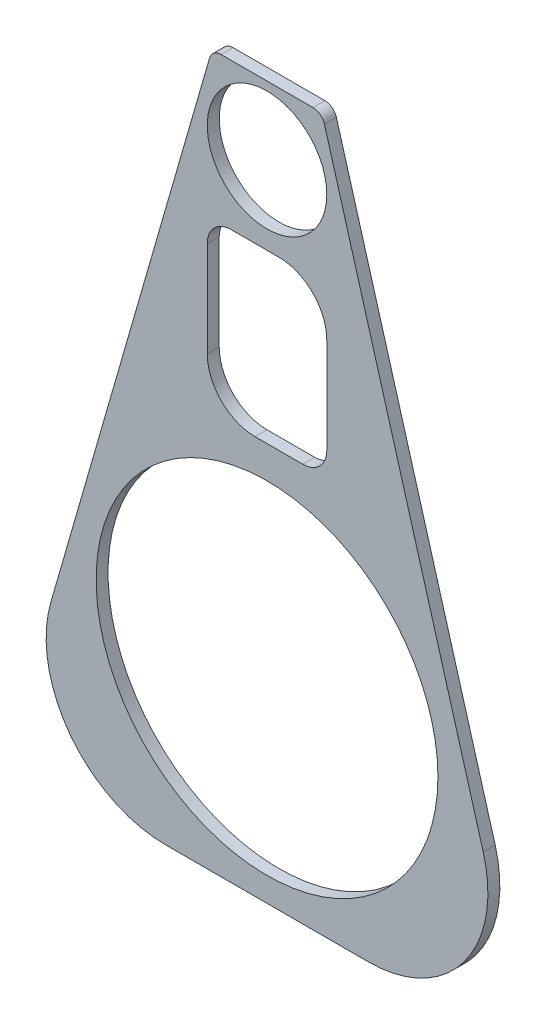
ISO-10303-21;
HEADER;
FILE_DESCRIPTION(('STEP AP214'),'2;1');
FILE_NAME('part.step','',(''),(''),'','','');
FILE_SCHEMA(('AUTOMOTIVE_DESIGN { 1 0 10303 214 1 1 1 1 }'));
ENDSEC;
DATA;
#1=APPLICATION_CONTEXT('core data for automotive mechanical design processes');
#2=APPLICATION_PROTOCOL_DEFINITION('international standard','automotive_design',2000,#1);
#3=PRODUCT_CONTEXT('',#1,'mechanical');
#4=PRODUCT('Part','Part','',(#3));
#5=PRODUCT_RELATED_PRODUCT_CATEGORY('part','',(#4));
#6=PRODUCT_DEFINITION_FORMATION('','',#4);
#7=PRODUCT_DEFINITION_CONTEXT('part definition',#1,'design');
#8=PRODUCT_DEFINITION('design','',#6,#7);
#9=PRODUCT_DEFINITION_SHAPE('','',#8);
#10=(LENGTH_UNIT() NAMED_UNIT(*) SI_UNIT(.MILLI.,.METRE.));
#11=(NAMED_UNIT(*) PLANE_ANGLE_UNIT() SI_UNIT($,.RADIAN.));
#12=(NAMED_UNIT(*) SI_UNIT($,.STERADIAN.) SOLID_ANGLE_UNIT());
#13=UNCERTAINTY_MEASURE_WITH_UNIT(LENGTH_MEASURE(1.E-05),#10,'distance_accuracy_value','');
#14=(GEOMETRIC_REPRESENTATION_CONTEXT(3) GLOBAL_UNCERTAINTY_ASSIGNED_CONTEXT((#13)) GLOBAL_UNIT_ASSIGNED_CONTEXT((#10,
#11,#12)) REPRESENTATION_CONTEXT('',''));
#15=CARTESIAN_POINT('',(0.,0.,0.));
#16=DIRECTION('',(0.,0.,1.));
#17=DIRECTION('',(1.,0.,0.));
#18=AXIS2_PLACEMENT_3D('',#15,#16,#17);
#19=CARTESIAN_POINT('',(4.4629257675573E-13,-1704.94474739678,50.));
#20=DIRECTION('',(0.,1.,0.));
#21=DIRECTION('',(-1.,0.,0.));
#22=AXIS2_PLACEMENT_3D('',#19,#20,#21);
#23=PLANE('',#22);
#24=DIRECTION('',(1.,0.,0.));
#25=VECTOR('',#24,1.);
#26=CARTESIAN_POINT('',(4.4629257675573E-13,-1704.94474739678,0.));
#27=LINE('',#26,#25);
#28=CARTESIAN_POINT('',(-358.81629058388,-1704.94474739678,0.));
#29=VERTEX_POINT('',#28);
#30=CARTESIAN_POINT('',(489.447387935539,-1704.94474739678,0.));
#31=VERTEX_POINT('',#30);
#32=EDGE_CURVE('E240',#29,#31,#27,.T.);
#33=ORIENTED_EDGE('',*,*,#32,.T.);
#34=DIRECTION('',(0.,0.,-1.));
#35=VECTOR('',#34,1.);
#36=CARTESIAN_POINT('',(489.447387935539,-1704.94474739678,50.));
#37=LINE('',#36,#35);
#38=CARTESIAN_POINT('',(489.447387935539,-1704.94474739678,50.));
#39=VERTEX_POINT('',#38);
#40=EDGE_CURVE('E11',#39,#31,#37,.T.);
#41=ORIENTED_EDGE('',*,*,#40,.F.);
#42=DIRECTION('',(1.,0.,0.));
#43=VECTOR('',#42,1.);
#44=CARTESIAN_POINT('',(4.4629257675573E-13,-1704.94474739678,50.));
#45=LINE('',#44,#43);
#46=CARTESIAN_POINT('',(-358.81629058388,-1704.94474739678,50.));
#47=VERTEX_POINT('',#46);
#48=EDGE_CURVE('E359',#47,#39,#45,.T.);
#49=ORIENTED_EDGE('',*,*,#48,.F.);
#50=DIRECTION('',(0.,0.,-1.));
#51=VECTOR('',#50,1.);
#52=CARTESIAN_POINT('',(-358.81629058388,-1704.94474739678,50.));
#53=LINE('',#52,#51);
#54=EDGE_CURVE('E265',#47,#29,#53,.T.);
#55=ORIENTED_EDGE('',*,*,#54,.T.);
#56=EDGE_LOOP('',(#33,#41,#49,#55));
#57=FACE_BOUND('',#56,.T.);
#58=ADVANCED_FACE('F47',(#57),#23,.F.);
#59=CARTESIAN_POINT('',(489.447387935539,-1204.94474739678,50.));
#60=DIRECTION('',(0.,0.,-1.));
#61=DIRECTION('',(-1.,0.,0.));
#62=AXIS2_PLACEMENT_3D('',#59,#60,#61);
#63=CYLINDRICAL_SURFACE('',#62,500.);
#64=CARTESIAN_POINT('',(489.447387935539,-1204.94474739678,0.));
#65=DIRECTION('',(0.,0.,1.));
#66=DIRECTION('',(1.,0.,0.));
#67=AXIS2_PLACEMENT_3D('',#64,#65,#66);
#68=CIRCLE('',#67,500.);
#69=CARTESIAN_POINT('',(969.886005151778,-1066.45743719347,0.));
#70=VERTEX_POINT('',#69);
#71=EDGE_CURVE('E244',#31,#70,#68,.T.);
#72=ORIENTED_EDGE('',*,*,#71,.T.);
#73=DIRECTION('',(0.,0.,-1.));
#74=VECTOR('',#73,1.);
#75=CARTESIAN_POINT('',(969.886005151778,-1066.45743719347,50.));
#76=LINE('',#75,#74);
#77=CARTESIAN_POINT('',(969.886005151778,-1066.45743719347,50.));
#78=VERTEX_POINT('',#77);
#79=EDGE_CURVE('E58',#78,#70,#76,.T.);
#80=ORIENTED_EDGE('',*,*,#79,.F.);
#81=CARTESIAN_POINT('',(489.447387935539,-1204.94474739678,50.));
#82=DIRECTION('',(0.,0.,1.));
#83=DIRECTION('',(1.,0.,0.));
#84=AXIS2_PLACEMENT_3D('',#81,#82,#83);
#85=CIRCLE('',#84,500.);
#86=EDGE_CURVE('E362',#39,#78,#85,.T.);
#87=ORIENTED_EDGE('',*,*,#86,.F.);
#88=ORIENTED_EDGE('',*,*,#40,.T.);
#89=EDGE_LOOP('',(#72,#80,#87,#88));
#90=FACE_BOUND('',#89,.T.);
#91=ADVANCED_FACE('F399',(#90),#63,.T.);
#92=CARTESIAN_POINT('',(611.65576107953,176.310891936767,50.));
#93=DIRECTION('',(-0.960877234432479,-0.276974620406618,0.));
#94=DIRECTION('',(0.276974620406618,-0.960877234432479,0.));
#95=AXIS2_PLACEMENT_3D('',#92,#93,#94);
#96=PLANE('',#95);
#97=DIRECTION('',(-0.276974620406618,0.960877234432479,0.));
#98=VECTOR('',#97,1.);
#99=CARTESIAN_POINT('',(611.65576107953,176.310891936767,0.));
#100=LINE('',#99,#98);
#101=CARTESIAN_POINT('',(305.514251948698,1238.3735683176,0.));
#102=VERTEX_POINT('',#101);
#103=EDGE_CURVE('E247',#70,#102,#100,.T.);
#104=ORIENTED_EDGE('',*,*,#103,.T.);
#105=DIRECTION('',(0.,0.,-1.));
#106=VECTOR('',#105,1.);
#107=CARTESIAN_POINT('',(305.514251948698,1238.3735683176,50.));
#108=LINE('',#107,#106);
#109=CARTESIAN_POINT('',(305.514251948698,1238.3735683176,50.));
#110=VERTEX_POINT('',#109);
#111=EDGE_CURVE('E275',#110,#102,#108,.T.);
#112=ORIENTED_EDGE('',*,*,#111,.F.);
#113=DIRECTION('',(-0.276974620406618,0.960877234432479,0.));
#114=VECTOR('',#113,1.);
#115=CARTESIAN_POINT('',(611.65576107953,176.310891936767,50.));
#116=LINE('',#115,#114);
#117=EDGE_CURVE('E365',#78,#110,#116,.T.);
#118=ORIENTED_EDGE('',*,*,#117,.F.);
#119=ORIENTED_EDGE('',*,*,#79,.T.);
#120=EDGE_LOOP('',(#104,#112,#118,#119));
#121=FACE_BOUND('',#120,.T.);
#122=ADVANCED_FACE('F404',(#121),#96,.F.);
#123=CARTESIAN_POINT('',(257.470390227074,1224.52483729727,50.));
#124=DIRECTION('',(0.,0.,-1.));
#125=DIRECTION('',(-1.,0.,0.));
#126=AXIS2_PLACEMENT_3D('',#123,#124,#125);
#127=CYLINDRICAL_SURFACE('',#126,50.0000000000002);
#128=CARTESIAN_POINT('',(257.470390227074,1224.52483729727,0.));
#129=DIRECTION('',(0.,0.,1.));
#130=DIRECTION('',(1.,0.,0.));
#131=AXIS2_PLACEMENT_3D('',#128,#129,#130);
#132=CIRCLE('',#131,50.0000000000002);
#133=CARTESIAN_POINT('',(257.470390227074,1274.52483729727,0.));
#134=VERTEX_POINT('',#133);
#135=EDGE_CURVE('E250',#102,#134,#132,.T.);
#136=ORIENTED_EDGE('',*,*,#135,.T.);
#137=DIRECTION('',(0.,0.,-1.));
#138=VECTOR('',#137,1.);
#139=CARTESIAN_POINT('',(257.470390227074,1274.52483729727,50.));
#140=LINE('',#139,#138);
#141=CARTESIAN_POINT('',(257.470390227074,1274.52483729727,50.));
#142=VERTEX_POINT('',#141);
#143=EDGE_CURVE('E272',#142,#134,#140,.T.);
#144=ORIENTED_EDGE('',*,*,#143,.F.);
#145=CARTESIAN_POINT('',(257.470390227074,1224.52483729727,50.));
#146=DIRECTION('',(0.,0.,1.));
#147=DIRECTION('',(1.,0.,0.));
#148=AXIS2_PLACEMENT_3D('',#145,#146,#147);
#149=CIRCLE('',#148,50.0000000000002);
#150=EDGE_CURVE('E195',#110,#142,#149,.T.);
#151=ORIENTED_EDGE('',*,*,#150,.F.);
#152=ORIENTED_EDGE('',*,*,#111,.T.);
#153=EDGE_LOOP('',(#136,#144,#151,#152));
#154=FACE_BOUND('',#153,.T.);
#155=ADVANCED_FACE('F373',(#154),#127,.T.);
#156=CARTESIAN_POINT('',(0.,1274.52483729727,50.));
#157=DIRECTION('',(0.,1.,0.));
#158=DIRECTION('',(0.,0.,1.));
#159=AXIS2_PLACEMENT_3D('',#156,#157,#158);
#160=PLANE('',#159);
#161=DIRECTION('',(1.,0.,0.));
#162=VECTOR('',#161,1.);
#163=CARTESIAN_POINT('',(0.,1274.52483729727,0.));
#164=LINE('',#163,#162);
#165=CARTESIAN_POINT('',(-126.839292875416,1274.52483729727,0.));
#166=VERTEX_POINT('',#165);
#167=EDGE_CURVE('E254',#166,#134,#164,.T.);
#168=ORIENTED_EDGE('',*,*,#167,.F.);
#169=DIRECTION('',(0.,0.,-1.));
#170=VECTOR('',#169,1.);
#171=CARTESIAN_POINT('',(-126.839292875416,1274.52483729727,50.));
#172=LINE('',#171,#170);
#173=CARTESIAN_POINT('',(-126.839292875416,1274.52483729727,50.));
#174=VERTEX_POINT('',#173);
#175=EDGE_CURVE('E181',#174,#166,#172,.T.);
#176=ORIENTED_EDGE('',*,*,#175,.F.);
#177=DIRECTION('',(1.,0.,0.));
#178=VECTOR('',#177,1.);
#179=CARTESIAN_POINT('',(0.,1274.52483729727,50.));
#180=LINE('',#179,#178);
#181=EDGE_CURVE('E191',#174,#142,#180,.T.);
#182=ORIENTED_EDGE('',*,*,#181,.T.);
#183=ORIENTED_EDGE('',*,*,#143,.T.);
#184=EDGE_LOOP('',(#168,#176,#182,#183));
#185=FACE_BOUND('',#184,.T.);
#186=ADVANCED_FACE('F377',(#185),#160,.T.);
#187=CARTESIAN_POINT('',(-126.839292875416,1224.52483729727,50.));
#188=DIRECTION('',(0.,0.,-1.));
#189=DIRECTION('',(-1.,0.,0.));
#190=AXIS2_PLACEMENT_3D('',#187,#188,#189);
#191=CYLINDRICAL_SURFACE('',#190,50.0000000000003);
#192=CARTESIAN_POINT('',(-126.839292875416,1224.52483729727,0.));
#193=DIRECTION('',(0.,0.,1.));
#194=DIRECTION('',(1.,0.,0.));
#195=AXIS2_PLACEMENT_3D('',#192,#193,#194);
#196=CIRCLE('',#195,50.0000000000003);
#197=CARTESIAN_POINT('',(-174.88315459704,1238.3735683176,0.));
#198=VERTEX_POINT('',#197);
#199=EDGE_CURVE('E179',#198,#166,#196,.F.);
#200=ORIENTED_EDGE('',*,*,#199,.F.);
#201=DIRECTION('',(0.,0.,-1.));
#202=VECTOR('',#201,1.);
#203=CARTESIAN_POINT('',(-174.88315459704,1238.3735683176,50.));
#204=LINE('',#203,#202);
#205=CARTESIAN_POINT('',(-174.88315459704,1238.3735683176,50.));
#206=VERTEX_POINT('',#205);
#207=EDGE_CURVE('E173',#206,#198,#204,.T.);
#208=ORIENTED_EDGE('',*,*,#207,.F.);
#209=CARTESIAN_POINT('',(-126.839292875416,1224.52483729727,50.));
#210=DIRECTION('',(0.,0.,1.));
#211=DIRECTION('',(1.,0.,0.));
#212=AXIS2_PLACEMENT_3D('',#209,#210,#211);
#213=CIRCLE('',#212,50.0000000000003);
#214=EDGE_CURVE('E177',#206,#174,#213,.F.);
#215=ORIENTED_EDGE('',*,*,#214,.T.);
#216=ORIENTED_EDGE('',*,*,#175,.T.);
#217=EDGE_LOOP('',(#200,#208,#215,#216));
#218=FACE_BOUND('',#217,.T.);
#219=ADVANCED_FACE('F175',(#218),#191,.T.);
#220=CARTESIAN_POINT('',(-491.046020568979,141.544913622189,50.));
#221=DIRECTION('',(0.960877234432479,-0.276974620406618,0.));
#222=DIRECTION('',(0.276974620406618,0.960877234432479,0.));
#223=AXIS2_PLACEMENT_3D('',#220,#221,#222);
#224=PLANE('',#223);
#225=DIRECTION('',(-0.276974620406618,-0.960877234432479,0.));
#226=VECTOR('',#225,1.);
#227=CARTESIAN_POINT('',(-491.046020568979,141.544913622189,0.));
#228=LINE('',#227,#226);
#229=CARTESIAN_POINT('',(-839.254907800119,-1066.45743719347,0.));
#230=VERTEX_POINT('',#229);
#231=EDGE_CURVE('E119',#198,#230,#228,.T.);
#232=ORIENTED_EDGE('',*,*,#231,.T.);
#233=DIRECTION('',(0.,0.,-1.));
#234=VECTOR('',#233,1.);
#235=CARTESIAN_POINT('',(-839.254907800119,-1066.45743719347,50.));
#236=LINE('',#235,#234);
#237=CARTESIAN_POINT('',(-839.254907800119,-1066.45743719347,50.));
#238=VERTEX_POINT('',#237);
#239=EDGE_CURVE('E182',#238,#230,#236,.T.);
#240=ORIENTED_EDGE('',*,*,#239,.F.);
#241=DIRECTION('',(-0.276974620406618,-0.960877234432479,0.));
#242=VECTOR('',#241,1.);
#243=CARTESIAN_POINT('',(-491.046020568979,141.544913622189,50.));
#244=LINE('',#243,#242);
#245=EDGE_CURVE('E184',#206,#238,#244,.T.);
#246=ORIENTED_EDGE('',*,*,#245,.F.);
#247=ORIENTED_EDGE('',*,*,#207,.T.);
#248=EDGE_LOOP('',(#232,#240,#246,#247));
#249=FACE_BOUND('',#248,.T.);
#250=ADVANCED_FACE('F185',(#249),#224,.F.);
#251=CARTESIAN_POINT('',(215.315548675829,61.108140821346,50.));
#252=DIRECTION('',(0.,0.,-1.));
#253=DIRECTION('',(-1.,0.,0.));
#254=AXIS2_PLACEMENT_3D('',#251,#252,#253);
#255=CYLINDRICAL_SURFACE('',#254,100.);
#256=CARTESIAN_POINT('',(215.315548675829,61.108140821346,0.));
#257=DIRECTION('',(0.,0.,1.));
#258=DIRECTION('',(1.,0.,0.));
#259=AXIS2_PLACEMENT_3D('',#256,#257,#258);
#260=CIRCLE('',#259,100.);
#261=CARTESIAN_POINT('',(215.315548675829,-38.891859178654,0.));
#262=VERTEX_POINT('',#261);
#263=CARTESIAN_POINT('',(315.315548675829,61.1081408213467,0.));
#264=VERTEX_POINT('',#263);
#265=EDGE_CURVE('E202',#262,#264,#260,.T.);
#266=ORIENTED_EDGE('',*,*,#265,.F.);
#267=DIRECTION('',(0.,0.,-1.));
#268=VECTOR('',#267,1.);
#269=CARTESIAN_POINT('',(215.315548675829,-38.891859178654,50.));
#270=LINE('',#269,#268);
#271=CARTESIAN_POINT('',(215.315548675829,-38.891859178654,50.));
#272=VERTEX_POINT('',#271);
#273=EDGE_CURVE('E51',#272,#262,#270,.T.);
#274=ORIENTED_EDGE('',*,*,#273,.F.);
#275=CARTESIAN_POINT('',(215.315548675829,61.108140821346,50.));
#276=DIRECTION('',(0.,0.,1.));
#277=DIRECTION('',(1.,0.,0.));
#278=AXIS2_PLACEMENT_3D('',#275,#276,#277);
#279=CIRCLE('',#278,100.);
#280=CARTESIAN_POINT('',(315.315548675829,61.1081408213467,50.));
#281=VERTEX_POINT('',#280);
#282=EDGE_CURVE('E264',#272,#281,#279,.T.);
#283=ORIENTED_EDGE('',*,*,#282,.T.);
#284=DIRECTION('',(0.,0.,-1.));
#285=VECTOR('',#284,1.);
#286=CARTESIAN_POINT('',(315.315548675829,61.1081408213467,50.));
#287=LINE('',#286,#285);
#288=EDGE_CURVE('E201',#281,#264,#287,.T.);
#289=ORIENTED_EDGE('',*,*,#288,.T.);
#290=EDGE_LOOP('',(#266,#274,#283,#289));
#291=FACE_BOUND('',#290,.T.);
#292=ADVANCED_FACE('F49',(#291),#255,.F.);
#293=CARTESIAN_POINT('',(0.,-38.891859178654,50.));
#294=DIRECTION('',(0.,1.,0.));
#295=DIRECTION('',(0.,0.,1.));
#296=AXIS2_PLACEMENT_3D('',#293,#294,#295);
#297=PLANE('',#296);
#298=DIRECTION('',(1.,0.,0.));
#299=VECTOR('',#298,1.);
#300=CARTESIAN_POINT('',(0.,-38.891859178654,0.));
#301=LINE('',#300,#299);
#302=CARTESIAN_POINT('',(15.3155486758307,-38.891859178654,0.));
#303=VERTEX_POINT('',#302);
#304=EDGE_CURVE('E206',#303,#262,#301,.T.);
#305=ORIENTED_EDGE('',*,*,#304,.F.);
#306=DIRECTION('',(0.,0.,-1.));
#307=VECTOR('',#306,1.);
#308=CARTESIAN_POINT('',(15.3155486758307,-38.891859178654,50.));
#309=LINE('',#308,#307);
#310=CARTESIAN_POINT('',(15.3155486758307,-38.891859178654,50.));
#311=VERTEX_POINT('',#310);
#312=EDGE_CURVE('E300',#311,#303,#309,.T.);
#313=ORIENTED_EDGE('',*,*,#312,.F.);
#314=DIRECTION('',(1.,0.,0.));
#315=VECTOR('',#314,1.);
#316=CARTESIAN_POINT('',(0.,-38.891859178654,50.));
#317=LINE('',#316,#315);
#318=EDGE_CURVE('E311',#311,#272,#317,.T.);
#319=ORIENTED_EDGE('',*,*,#318,.T.);
#320=ORIENTED_EDGE('',*,*,#273,.T.);
#321=EDGE_LOOP('',(#305,#313,#319,#320));
#322=FACE_BOUND('',#321,.T.);
#323=ADVANCED_FACE('F309',(#322),#297,.T.);
#324=CARTESIAN_POINT('',(15.3155486758292,161.108140821346,50.));
#325=DIRECTION('',(0.,0.,-1.));
#326=DIRECTION('',(-1.,0.,0.));
#327=AXIS2_PLACEMENT_3D('',#324,#325,#326);
#328=CYLINDRICAL_SURFACE('',#327,200.);
#329=CARTESIAN_POINT('',(15.3155486758292,161.108140821346,0.));
#330=DIRECTION('',(0.,0.,1.));
#331=DIRECTION('',(1.,0.,0.));
#332=AXIS2_PLACEMENT_3D('',#329,#330,#331);
#333=CIRCLE('',#332,200.);
#334=CARTESIAN_POINT('',(-184.684451324171,161.108140821347,0.));
#335=VERTEX_POINT('',#334);
#336=EDGE_CURVE('E210',#335,#303,#333,.T.);
#337=ORIENTED_EDGE('',*,*,#336,.F.);
#338=DIRECTION('',(0.,0.,-1.));
#339=VECTOR('',#338,1.);
#340=CARTESIAN_POINT('',(-184.684451324171,161.108140821347,50.));
#341=LINE('',#340,#339);
#342=CARTESIAN_POINT('',(-184.684451324171,161.108140821347,50.));
#343=VERTEX_POINT('',#342);
#344=EDGE_CURVE('E298',#343,#335,#341,.T.);
#345=ORIENTED_EDGE('',*,*,#344,.F.);
#346=CARTESIAN_POINT('',(15.3155486758292,161.108140821346,50.));
#347=DIRECTION('',(0.,0.,1.));
#348=DIRECTION('',(1.,0.,0.));
#349=AXIS2_PLACEMENT_3D('',#346,#347,#348);
#350=CIRCLE('',#349,200.);
#351=EDGE_CURVE('E321',#343,#311,#350,.T.);
#352=ORIENTED_EDGE('',*,*,#351,.T.);
#353=ORIENTED_EDGE('',*,*,#312,.T.);
#354=EDGE_LOOP('',(#337,#345,#352,#353));
#355=FACE_BOUND('',#354,.T.);
#356=ADVANCED_FACE('F318',(#355),#328,.F.);
#357=CARTESIAN_POINT('',(-184.684451324171,0.,50.));
#358=DIRECTION('',(-1.,0.,0.));
#359=DIRECTION('',(0.,0.,1.));
#360=AXIS2_PLACEMENT_3D('',#357,#358,#359);
#361=PLANE('',#360);
#362=DIRECTION('',(0.,1.,0.));
#363=VECTOR('',#362,1.);
#364=CARTESIAN_POINT('',(-184.684451324171,0.,0.));
#365=LINE('',#364,#363);
#366=CARTESIAN_POINT('',(-184.684451324171,561.108140821345,0.));
#367=VERTEX_POINT('',#366);
#368=EDGE_CURVE('E214',#335,#367,#365,.T.);
#369=ORIENTED_EDGE('',*,*,#368,.T.);
#370=DIRECTION('',(0.,0.,-1.));
#371=VECTOR('',#370,1.);
#372=CARTESIAN_POINT('',(-184.684451324171,561.108140821345,50.));
#373=LINE('',#372,#371);
#374=CARTESIAN_POINT('',(-184.684451324171,561.108140821345,50.));
#375=VERTEX_POINT('',#374);
#376=EDGE_CURVE('E294',#375,#367,#373,.T.);
#377=ORIENTED_EDGE('',*,*,#376,.F.);
#378=DIRECTION('',(0.,1.,0.));
#379=VECTOR('',#378,1.);
#380=CARTESIAN_POINT('',(-184.684451324171,0.,50.));
#381=LINE('',#380,#379);
#382=EDGE_CURVE('E324',#343,#375,#381,.T.);
#383=ORIENTED_EDGE('',*,*,#382,.F.);
#384=ORIENTED_EDGE('',*,*,#344,.T.);
#385=EDGE_LOOP('',(#369,#377,#383,#384));
#386=FACE_BOUND('',#385,.T.);
#387=ADVANCED_FACE('F325',(#386),#361,.F.);
#388=CARTESIAN_POINT('',(-84.6844513241708,561.108140821346,50.));
#389=DIRECTION('',(0.,0.,-1.));
#390=DIRECTION('',(-1.,0.,0.));
#391=AXIS2_PLACEMENT_3D('',#388,#389,#390);
#392=CYLINDRICAL_SURFACE('',#391,100.);
#393=CARTESIAN_POINT('',(-84.6844513241708,561.108140821346,0.));
#394=DIRECTION('',(0.,0.,1.));
#395=DIRECTION('',(1.,0.,0.));
#396=AXIS2_PLACEMENT_3D('',#393,#394,#395);
#397=CIRCLE('',#396,100.);
#398=CARTESIAN_POINT('',(-84.68445132417,661.108140821346,0.));
#399=VERTEX_POINT('',#398);
#400=EDGE_CURVE('E217',#367,#399,#397,.F.);
#401=ORIENTED_EDGE('',*,*,#400,.T.);
#402=DIRECTION('',(0.,0.,-1.));
#403=VECTOR('',#402,1.);
#404=CARTESIAN_POINT('',(-84.68445132417,661.108140821346,50.));
#405=LINE('',#404,#403);
#406=CARTESIAN_POINT('',(-84.68445132417,661.108140821346,50.));
#407=VERTEX_POINT('',#406);
#408=EDGE_CURVE('E290',#407,#399,#405,.T.);
#409=ORIENTED_EDGE('',*,*,#408,.F.);
#410=CARTESIAN_POINT('',(-84.6844513241708,561.108140821346,50.));
#411=DIRECTION('',(0.,0.,1.));
#412=DIRECTION('',(1.,0.,0.));
#413=AXIS2_PLACEMENT_3D('',#410,#411,#412);
#414=CIRCLE('',#413,100.);
#415=EDGE_CURVE('E329',#375,#407,#414,.F.);
#416=ORIENTED_EDGE('',*,*,#415,.F.);
#417=ORIENTED_EDGE('',*,*,#376,.T.);
#418=EDGE_LOOP('',(#401,#409,#416,#417));
#419=FACE_BOUND('',#418,.T.);
#420=ADVANCED_FACE('F423',(#419),#392,.F.);
#421=CARTESIAN_POINT('',(0.,661.108140821346,50.));
#422=DIRECTION('',(0.,1.,0.));
#423=DIRECTION('',(0.,0.,1.));
#424=AXIS2_PLACEMENT_3D('',#421,#422,#423);
#425=PLANE('',#424);
#426=DIRECTION('',(1.,0.,0.));
#427=VECTOR('',#426,1.);
#428=CARTESIAN_POINT('',(0.,661.108140821346,0.));
#429=LINE('',#428,#427);
#430=CARTESIAN_POINT('',(115.315548675828,661.108140821346,0.));
#431=VERTEX_POINT('',#430);
#432=EDGE_CURVE('E220',#399,#431,#429,.T.);
#433=ORIENTED_EDGE('',*,*,#432,.T.);
#434=DIRECTION('',(0.,0.,-1.));
#435=VECTOR('',#434,1.);
#436=CARTESIAN_POINT('',(115.315548675828,661.108140821346,50.));
#437=LINE('',#436,#435);
#438=CARTESIAN_POINT('',(115.315548675828,661.108140821346,50.));
#439=VERTEX_POINT('',#438);
#440=EDGE_CURVE('E287',#439,#431,#437,.T.);
#441=ORIENTED_EDGE('',*,*,#440,.F.);
#442=DIRECTION('',(1.,0.,0.));
#443=VECTOR('',#442,1.);
#444=CARTESIAN_POINT('',(0.,661.108140821346,50.));
#445=LINE('',#444,#443);
#446=EDGE_CURVE('E340',#407,#439,#445,.T.);
#447=ORIENTED_EDGE('',*,*,#446,.F.);
#448=ORIENTED_EDGE('',*,*,#408,.T.);
#449=EDGE_LOOP('',(#433,#441,#447,#448));
#450=FACE_BOUND('',#449,.T.);
#451=ADVANCED_FACE('F419',(#450),#425,.F.);
#452=CARTESIAN_POINT('',(115.315548675829,461.108140821346,50.));
#453=DIRECTION('',(0.,0.,-1.));
#454=DIRECTION('',(-1.,0.,0.));
#455=AXIS2_PLACEMENT_3D('',#452,#453,#454);
#456=CYLINDRICAL_SURFACE('',#455,200.);
#457=CARTESIAN_POINT('',(115.315548675829,461.108140821346,0.));
#458=DIRECTION('',(0.,0.,1.));
#459=DIRECTION('',(1.,0.,0.));
#460=AXIS2_PLACEMENT_3D('',#457,#458,#459);
#461=CIRCLE('',#460,200.);
#462=CARTESIAN_POINT('',(315.315548675829,461.108140821345,0.));
#463=VERTEX_POINT('',#462);
#464=EDGE_CURVE('E224',#463,#431,#461,.T.);
#465=ORIENTED_EDGE('',*,*,#464,.F.);
#466=DIRECTION('',(0.,0.,-1.));
#467=VECTOR('',#466,1.);
#468=CARTESIAN_POINT('',(315.315548675829,461.108140821345,50.));
#469=LINE('',#468,#467);
#470=CARTESIAN_POINT('',(315.315548675829,461.108140821345,50.));
#471=VERTEX_POINT('',#470);
#472=EDGE_CURVE('E284',#471,#463,#469,.T.);
#473=ORIENTED_EDGE('',*,*,#472,.F.);
#474=CARTESIAN_POINT('',(115.315548675829,461.108140821346,50.));
#475=DIRECTION('',(0.,0.,1.));
#476=DIRECTION('',(1.,0.,0.));
#477=AXIS2_PLACEMENT_3D('',#474,#475,#476);
#478=CIRCLE('',#477,200.);
#479=EDGE_CURVE('E343',#471,#439,#478,.T.);
#480=ORIENTED_EDGE('',*,*,#479,.T.);
#481=ORIENTED_EDGE('',*,*,#440,.T.);
#482=EDGE_LOOP('',(#465,#473,#480,#481));
#483=FACE_BOUND('',#482,.T.);
#484=ADVANCED_FACE('F412',(#483),#456,.F.);
#485=CARTESIAN_POINT('',(65.3155486758294,-888.891859178654,50.));
#486=DIRECTION('',(0.,0.,-1.));
#487=DIRECTION('',(-1.,0.,0.));
#488=AXIS2_PLACEMENT_3D('',#485,#486,#487);
#489=CYLINDRICAL_SURFACE('',#488,715.);
#490=CARTESIAN_POINT('',(65.3155486758294,-888.891859178654,50.));
#491=DIRECTION('',(0.,0.,1.));
#492=DIRECTION('',(1.,0.,0.));
#493=AXIS2_PLACEMENT_3D('',#490,#491,#492);
#494=CIRCLE('',#493,715.);
#495=CARTESIAN_POINT('',(780.315548675829,-888.891859178654,50.));
#496=VERTEX_POINT('',#495);
#497=EDGE_CURVE('E355',#496,#496,#494,.T.);
#498=ORIENTED_EDGE('',*,*,#497,.T.);
#499=EDGE_LOOP('',(#498));
#500=FACE_BOUND('',#499,.T.);
#501=CARTESIAN_POINT('',(65.3155486758294,-888.891859178654,0.));
#502=DIRECTION('',(0.,0.,1.));
#503=DIRECTION('',(1.,0.,0.));
#504=AXIS2_PLACEMENT_3D('',#501,#502,#503);
#505=CIRCLE('',#504,715.);
#506=CARTESIAN_POINT('',(780.315548675829,-888.891859178654,0.));
#507=VERTEX_POINT('',#506);
#508=EDGE_CURVE('E236',#507,#507,#505,.T.);
#509=ORIENTED_EDGE('',*,*,#508,.F.);
#510=EDGE_LOOP('',(#509));
#511=FACE_BOUND('',#510,.T.);
#512=ADVANCED_FACE('F409',(#500,#511),#489,.F.);
#513=CARTESIAN_POINT('',(65.315548675829,988.53647427877,50.));
#514=DIRECTION('',(0.,0.,-1.));
#515=DIRECTION('',(-1.,0.,0.));
#516=AXIS2_PLACEMENT_3D('',#513,#514,#515);
#517=CYLINDRICAL_SURFACE('',#516,250.);
#518=CARTESIAN_POINT('',(65.315548675829,988.53647427877,50.));
#519=DIRECTION('',(0.,0.,1.));
#520=DIRECTION('',(1.,0.,0.));
#521=AXIS2_PLACEMENT_3D('',#518,#519,#520);
#522=CIRCLE('',#521,250.);
#523=CARTESIAN_POINT('',(315.315548675829,988.53647427877,50.));
#524=VERTEX_POINT('',#523);
#525=EDGE_CURVE('E351',#524,#524,#522,.T.);
#526=ORIENTED_EDGE('',*,*,#525,.T.);
#527=EDGE_LOOP('',(#526));
#528=FACE_BOUND('',#527,.T.);
#529=CARTESIAN_POINT('',(65.315548675829,988.53647427877,0.));
#530=DIRECTION('',(0.,0.,1.));
#531=DIRECTION('',(1.,0.,0.));
#532=AXIS2_PLACEMENT_3D('',#529,#530,#531);
#533=CIRCLE('',#532,250.);
#534=CARTESIAN_POINT('',(315.315548675829,988.53647427877,0.));
#535=VERTEX_POINT('',#534);
#536=EDGE_CURVE('E232',#535,#535,#533,.T.);
#537=ORIENTED_EDGE('',*,*,#536,.F.);
#538=EDGE_LOOP('',(#537));
#539=FACE_BOUND('',#538,.T.);
#540=ADVANCED_FACE('F393',(#528,#539),#517,.F.);
#541=CARTESIAN_POINT('',(315.315548675829,0.,50.));
#542=DIRECTION('',(-1.,0.,0.));
#543=DIRECTION('',(0.,0.,1.));
#544=AXIS2_PLACEMENT_3D('',#541,#542,#543);
#545=PLANE('',#544);
#546=DIRECTION('',(0.,1.,0.));
#547=VECTOR('',#546,1.);
#548=CARTESIAN_POINT('',(315.315548675829,0.,0.));
#549=LINE('',#548,#547);
#550=EDGE_CURVE('E228',#264,#463,#549,.T.);
#551=ORIENTED_EDGE('',*,*,#550,.F.);
#552=ORIENTED_EDGE('',*,*,#288,.F.);
#553=DIRECTION('',(0.,1.,0.));
#554=VECTOR('',#553,1.);
#555=CARTESIAN_POINT('',(315.315548675829,0.,50.));
#556=LINE('',#555,#554);
#557=EDGE_CURVE('E347',#281,#471,#556,.T.);
#558=ORIENTED_EDGE('',*,*,#557,.T.);
#559=ORIENTED_EDGE('',*,*,#472,.T.);
#560=EDGE_LOOP('',(#551,#552,#558,#559));
#561=FACE_BOUND('',#560,.T.);
#562=ADVANCED_FACE('F386',(#561),#545,.T.);
#563=CARTESIAN_POINT('',(-358.81629058388,-1204.94474739678,50.));
#564=DIRECTION('',(0.,0.,-1.));
#565=DIRECTION('',(-1.,0.,0.));
#566=AXIS2_PLACEMENT_3D('',#563,#564,#565);
#567=CYLINDRICAL_SURFACE('',#566,500.);
#568=CARTESIAN_POINT('',(-358.81629058388,-1204.94474739678,0.));
#569=DIRECTION('',(0.,0.,1.));
#570=DIRECTION('',(1.,0.,0.));
#571=AXIS2_PLACEMENT_3D('',#568,#569,#570);
#572=CIRCLE('',#571,500.);
#573=EDGE_CURVE('E125',#230,#29,#572,.T.);
#574=ORIENTED_EDGE('',*,*,#573,.T.);
#575=ORIENTED_EDGE('',*,*,#54,.F.);
#576=CARTESIAN_POINT('',(-358.81629058388,-1204.94474739678,50.));
#577=DIRECTION('',(0.,0.,1.));
#578=DIRECTION('',(1.,0.,0.));
#579=AXIS2_PLACEMENT_3D('',#576,#577,#578);
#580=CIRCLE('',#579,500.);
#581=EDGE_CURVE('E67',#238,#47,#580,.T.);
#582=ORIENTED_EDGE('',*,*,#581,.F.);
#583=ORIENTED_EDGE('',*,*,#239,.T.);
#584=EDGE_LOOP('',(#574,#575,#582,#583));
#585=FACE_BOUND('',#584,.T.);
#586=ADVANCED_FACE('F384',(#585),#567,.T.);
#587=CARTESIAN_POINT('',(0.,0.,50.));
#588=DIRECTION('',(0.,0.,1.));
#589=DIRECTION('',(1.,0.,0.));
#590=AXIS2_PLACEMENT_3D('',#587,#588,#589);
#591=PLANE('',#590);
#592=ORIENTED_EDGE('',*,*,#282,.F.);
#593=ORIENTED_EDGE('',*,*,#318,.F.);
#594=ORIENTED_EDGE('',*,*,#351,.F.);
#595=ORIENTED_EDGE('',*,*,#382,.T.);
#596=ORIENTED_EDGE('',*,*,#415,.T.);
#597=ORIENTED_EDGE('',*,*,#446,.T.);
#598=ORIENTED_EDGE('',*,*,#479,.F.);
#599=ORIENTED_EDGE('',*,*,#557,.F.);
#600=EDGE_LOOP('',(#592,#593,#594,#595,#596,#597,#598,#599));
#601=FACE_BOUND('',#600,.T.);
#602=ORIENTED_EDGE('',*,*,#525,.F.);
#603=EDGE_LOOP('',(#602));
#604=FACE_BOUND('',#603,.T.);
#605=ORIENTED_EDGE('',*,*,#497,.F.);
#606=EDGE_LOOP('',(#605));
#607=FACE_BOUND('',#606,.T.);
#608=ORIENTED_EDGE('',*,*,#48,.T.);
#609=ORIENTED_EDGE('',*,*,#86,.T.);
#610=ORIENTED_EDGE('',*,*,#117,.T.);
#611=ORIENTED_EDGE('',*,*,#150,.T.);
#612=ORIENTED_EDGE('',*,*,#181,.F.);
#613=ORIENTED_EDGE('',*,*,#214,.F.);
#614=ORIENTED_EDGE('',*,*,#245,.T.);
#615=ORIENTED_EDGE('',*,*,#581,.T.);
#616=EDGE_LOOP('',(#608,#609,#610,#611,#612,#613,#614,#615));
#617=FACE_BOUND('',#616,.T.);
#618=ADVANCED_FACE('F189',(#601,#604,#607,#617),#591,.T.);
#619=CARTESIAN_POINT('',(0.,0.,0.));
#620=DIRECTION('',(0.,0.,1.));
#621=DIRECTION('',(1.,0.,0.));
#622=AXIS2_PLACEMENT_3D('',#619,#620,#621);
#623=PLANE('',#622);
#624=ORIENTED_EDGE('',*,*,#265,.T.);
#625=ORIENTED_EDGE('',*,*,#550,.T.);
#626=ORIENTED_EDGE('',*,*,#464,.T.);
#627=ORIENTED_EDGE('',*,*,#432,.F.);
#628=ORIENTED_EDGE('',*,*,#400,.F.);
#629=ORIENTED_EDGE('',*,*,#368,.F.);
#630=ORIENTED_EDGE('',*,*,#336,.T.);
#631=ORIENTED_EDGE('',*,*,#304,.T.);
#632=EDGE_LOOP('',(#624,#625,#626,#627,#628,#629,#630,#631));
#633=FACE_BOUND('',#632,.T.);
#634=ORIENTED_EDGE('',*,*,#536,.T.);
#635=EDGE_LOOP('',(#634));
#636=FACE_BOUND('',#635,.T.);
#637=ORIENTED_EDGE('',*,*,#508,.T.);
#638=EDGE_LOOP('',(#637));
#639=FACE_BOUND('',#638,.T.);
#640=ORIENTED_EDGE('',*,*,#32,.F.);
#641=ORIENTED_EDGE('',*,*,#573,.F.);
#642=ORIENTED_EDGE('',*,*,#231,.F.);
#643=ORIENTED_EDGE('',*,*,#199,.T.);
#644=ORIENTED_EDGE('',*,*,#167,.T.);
#645=ORIENTED_EDGE('',*,*,#135,.F.);
#646=ORIENTED_EDGE('',*,*,#103,.F.);
#647=ORIENTED_EDGE('',*,*,#71,.F.);
#648=EDGE_LOOP('',(#640,#641,#642,#643,#644,#645,#646,#647));
#649=FACE_BOUND('',#648,.T.);
#650=ADVANCED_FACE('F314',(#633,#636,#639,#649),#623,.F.);
#651=CLOSED_SHELL('',(#58,#91,#122,#155,#186,#219,#250,#292,#323,#356,#387,#420,#451,#484,#512,
#540,#562,#586,#618,#650));
#652=MANIFOLD_SOLID_BREP('B2',#651);
#653=ADVANCED_BREP_SHAPE_REPRESENTATION('',(#18,#652),#14);
#654=SHAPE_DEFINITION_REPRESENTATION(#9,#653);
ENDSEC;
END-ISO-10303-21;
